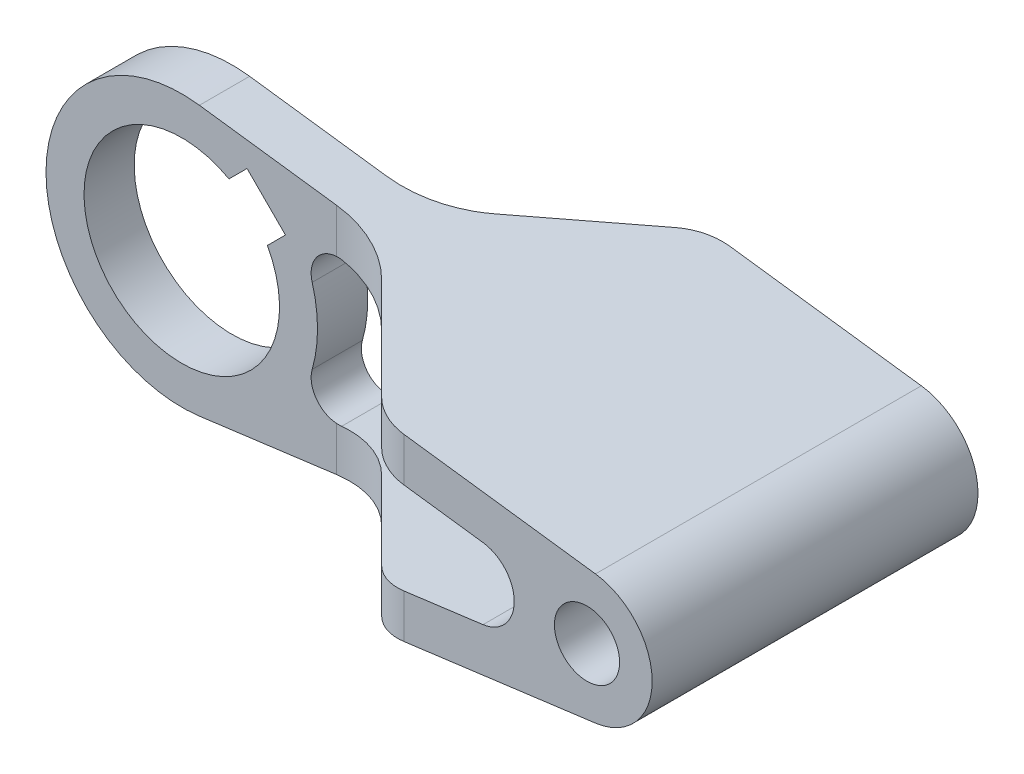
ISO-10303-21;
HEADER;
FILE_DESCRIPTION(('STEP AP214'),'2;1');
FILE_NAME('part.step','',(''),(''),'','','');
FILE_SCHEMA(('AUTOMOTIVE_DESIGN { 1 0 10303 214 1 1 1 1 }'));
ENDSEC;
DATA;
#1=APPLICATION_CONTEXT('core data for automotive mechanical design processes');
#2=APPLICATION_PROTOCOL_DEFINITION('international standard','automotive_design',2000,#1);
#3=PRODUCT_CONTEXT('',#1,'mechanical');
#4=PRODUCT('Part','Part','',(#3));
#5=PRODUCT_RELATED_PRODUCT_CATEGORY('part','',(#4));
#6=PRODUCT_DEFINITION_FORMATION('','',#4);
#7=PRODUCT_DEFINITION_CONTEXT('part definition',#1,'design');
#8=PRODUCT_DEFINITION('design','',#6,#7);
#9=PRODUCT_DEFINITION_SHAPE('','',#8);
#10=(LENGTH_UNIT() NAMED_UNIT(*) SI_UNIT(.MILLI.,.METRE.));
#11=(NAMED_UNIT(*) PLANE_ANGLE_UNIT() SI_UNIT($,.RADIAN.));
#12=(NAMED_UNIT(*) SI_UNIT($,.STERADIAN.) SOLID_ANGLE_UNIT());
#13=UNCERTAINTY_MEASURE_WITH_UNIT(LENGTH_MEASURE(1.E-05),#10,'distance_accuracy_value','');
#14=(GEOMETRIC_REPRESENTATION_CONTEXT(3) GLOBAL_UNCERTAINTY_ASSIGNED_CONTEXT((#13)) GLOBAL_UNIT_ASSIGNED_CONTEXT((#10,
#11,#12)) REPRESENTATION_CONTEXT('',''));
#15=CARTESIAN_POINT('',(0.,0.,0.));
#16=DIRECTION('',(0.,0.,1.));
#17=DIRECTION('',(1.,0.,0.));
#18=AXIS2_PLACEMENT_3D('',#15,#16,#17);
#19=CARTESIAN_POINT('',(-28.68481683323,8.32375888413215,30.));
#20=DIRECTION('',(0.,0.,-1.));
#21=DIRECTION('',(-1.,0.,0.));
#22=AXIS2_PLACEMENT_3D('',#19,#20,#21);
#23=CYLINDRICAL_SURFACE('',#22,5.00000000000005);
#24=CARTESIAN_POINT('',(-28.9834349837125,13.3148336381509,4.62148917251252));
#25=CARTESIAN_POINT('',(-28.8247121095358,13.324287625708,4.62150230724699));
#26=CARTESIAN_POINT('',(-28.6662991599073,13.3262225540891,4.62338467269021));
#27=CARTESIAN_POINT('',(-28.3500931097465,13.3150542924993,4.63088786499418));
#28=CARTESIAN_POINT('',(-28.1923000092142,13.3019511025283,4.63650869185494));
#29=CARTESIAN_POINT('',(-28.0348168332301,13.2813288533813,4.64399874942446));
#30=B_SPLINE_CURVE_WITH_KNOTS('',3,(#24,#25,#26,#27,#28,#29),.UNSPECIFIED.,.F.,.F.,(4,2,4),(0.,
0.475307846261125,0.9506156925236),.UNSPECIFIED.);
#31=CARTESIAN_POINT('',(-28.9834349837125,13.3148336381509,4.62148917251252));
#32=VERTEX_POINT('',#31);
#33=CARTESIAN_POINT('',(-28.0348168332301,13.2813288533813,4.64399874942446));
#34=VERTEX_POINT('',#33);
#35=EDGE_CURVE('E312',#32,#34,#30,.T.);
#36=ORIENTED_EDGE('',*,*,#35,.F.);
#37=CARTESIAN_POINT('',(-28.68481683323,8.32375888413215,4.62148917251252));
#38=DIRECTION('',(0.,0.,1.));
#39=DIRECTION('',(1.,0.,0.));
#40=AXIS2_PLACEMENT_3D('',#37,#38,#39);
#41=CIRCLE('',#40,5.00000000000005);
#42=CARTESIAN_POINT('',(-33.4885047626547,6.93646573677681,4.62148917251252));
#43=VERTEX_POINT('',#42);
#44=EDGE_CURVE('E244',#43,#32,#41,.F.);
#45=ORIENTED_EDGE('',*,*,#44,.F.);
#46=DIRECTION('',(0.,0.,-1.));
#47=VECTOR('',#46,1.);
#48=CARTESIAN_POINT('',(-33.4885047626547,6.93646573677681,30.));
#49=LINE('',#48,#47);
#50=CARTESIAN_POINT('',(-33.4885047626547,6.93646573677681,-4.62148917251252));
#51=VERTEX_POINT('',#50);
#52=EDGE_CURVE('E441',#43,#51,#49,.T.);
#53=ORIENTED_EDGE('',*,*,#52,.T.);
#54=CARTESIAN_POINT('',(-28.68481683323,8.32375888413215,-4.62148917251252));
#55=DIRECTION('',(0.,0.,1.));
#56=DIRECTION('',(1.,0.,0.));
#57=AXIS2_PLACEMENT_3D('',#54,#55,#56);
#58=CIRCLE('',#57,5.00000000000005);
#59=CARTESIAN_POINT('',(-28.9834349837125,13.3148336381509,-4.62148917251252));
#60=VERTEX_POINT('',#59);
#61=EDGE_CURVE('E525',#51,#60,#58,.F.);
#62=ORIENTED_EDGE('',*,*,#61,.T.);
#63=CARTESIAN_POINT('',(-28.0348168332301,13.2813288533813,-4.64399874942446));
#64=CARTESIAN_POINT('',(-28.1923000092142,13.3019511025283,-4.63650869185494));
#65=CARTESIAN_POINT('',(-28.3500931097465,13.3150542924993,-4.63088786499418));
#66=CARTESIAN_POINT('',(-28.6662991599073,13.3262225540891,-4.62338467269022));
#67=CARTESIAN_POINT('',(-28.8247121095358,13.324287625708,-4.62150230724699));
#68=CARTESIAN_POINT('',(-28.9834349837125,13.3148336381509,-4.62148917251253));
#69=B_SPLINE_CURVE_WITH_KNOTS('',3,(#63,#64,#65,#66,#67,#68),.UNSPECIFIED.,.F.,.F.,(4,2,4),(0.,
0.475307846262482,0.950615692523614),.UNSPECIFIED.);
#70=CARTESIAN_POINT('',(-28.0348168332301,13.2813288533813,-4.64399874942445));
#71=VERTEX_POINT('',#70);
#72=EDGE_CURVE('E333',#71,#60,#69,.T.);
#73=ORIENTED_EDGE('',*,*,#72,.F.);
#74=DIRECTION('',(0.,0.,-1.));
#75=VECTOR('',#74,1.);
#76=CARTESIAN_POINT('',(-28.0348168332301,13.2813288533813,30.));
#77=LINE('',#76,#75);
#78=EDGE_CURVE('E439',#34,#71,#77,.T.);
#79=ORIENTED_EDGE('',*,*,#78,.F.);
#80=EDGE_LOOP('',(#36,#45,#53,#62,#73,#79));
#81=FACE_BOUND('',#80,.T.);
#82=ADVANCED_FACE('F35',(#81),#23,.F.);
#83=CARTESIAN_POINT('',(1.23813263947478,9.44327567908777,30.));
#84=DIRECTION('',(0.130000000000003,0.991513993849809,0.));
#85=DIRECTION('',(-0.991513993849809,0.130000000000003,0.));
#86=AXIS2_PLACEMENT_3D('',#83,#84,#85);
#87=PLANE('',#86);
#88=DIRECTION('',(0.704087348631939,-0.092314738763051,-0.70408734863194));
#89=VECTOR('',#88,1.);
#90=CARTESIAN_POINT('',(-26.8002628385508,13.119463241495,1.4796099297878));
#91=LINE('',#90,#89);
#92=CARTESIAN_POINT('',(-14.8412993599814,11.5514921771859,-10.4793535487816));
#93=VERTEX_POINT('',#92);
#94=CARTESIAN_POINT('',(1.75041490310239,9.37610900803252,-27.0710678118655));
#95=VERTEX_POINT('',#94);
#96=EDGE_CURVE('E507',#93,#95,#91,.T.);
#97=ORIENTED_EDGE('',*,*,#96,.T.);
#98=CARTESIAN_POINT('',(8.82148271496788,8.4490027631944,-20.));
#99=DIRECTION('',(0.130000000000003,0.991513993849809,0.));
#100=DIRECTION('',(-0.991513993849809,0.130000000000003,0.));
#101=AXIS2_PLACEMENT_3D('',#98,#99,#100);
#102=ELLIPSE('',#101,10.0855863477755,10.);
#103=CARTESIAN_POINT('',(8.82148271496788,8.4490027631944,-30.));
#104=VERTEX_POINT('',#103);
#105=EDGE_CURVE('E393',#95,#104,#102,.F.);
#106=ORIENTED_EDGE('',*,*,#105,.T.);
#107=DIRECTION('',(0.991513993849809,-0.130000000000003,0.));
#108=VECTOR('',#107,1.);
#109=CARTESIAN_POINT('',(1.23813263947478,9.44327567908777,-30.));
#110=LINE('',#109,#108);
#111=CARTESIAN_POINT('',(23.3510555902217,6.54399235940866,-30.));
#112=VERTEX_POINT('',#111);
#113=EDGE_CURVE('E574',#104,#112,#110,.T.);
#114=ORIENTED_EDGE('',*,*,#113,.T.);
#115=DIRECTION('',(0.,0.,-1.));
#116=VECTOR('',#115,1.);
#117=CARTESIAN_POINT('',(23.3510555902217,6.54399235940866,30.));
#118=LINE('',#117,#116);
#119=CARTESIAN_POINT('',(23.3510555902217,6.54399235940866,30.));
#120=VERTEX_POINT('',#119);
#121=EDGE_CURVE('E436',#120,#112,#118,.T.);
#122=ORIENTED_EDGE('',*,*,#121,.F.);
#123=DIRECTION('',(0.991513993849809,-0.130000000000003,0.));
#124=VECTOR('',#123,1.);
#125=CARTESIAN_POINT('',(1.23813263947478,9.44327567908777,30.));
#126=LINE('',#125,#124);
#127=CARTESIAN_POINT('',(8.82148271496788,8.4490027631944,30.));
#128=VERTEX_POINT('',#127);
#129=EDGE_CURVE('E465',#128,#120,#126,.T.);
#130=ORIENTED_EDGE('',*,*,#129,.F.);
#131=CARTESIAN_POINT('',(8.82148271496788,8.4490027631944,20.));
#132=DIRECTION('',(0.130000000000003,0.991513993849809,0.));
#133=DIRECTION('',(0.991513993849809,-0.130000000000003,0.));
#134=AXIS2_PLACEMENT_3D('',#131,#132,#133);
#135=ELLIPSE('',#134,10.0855863477755,10.);
#136=CARTESIAN_POINT('',(1.7504149031024,9.37610900803251,27.0710678118655));
#137=VERTEX_POINT('',#136);
#138=EDGE_CURVE('E50',#128,#137,#135,.F.);
#139=ORIENTED_EDGE('',*,*,#138,.T.);
#140=DIRECTION('',(0.704087348631939,-0.092314738763051,0.70408734863194));
#141=VECTOR('',#140,1.);
#142=CARTESIAN_POINT('',(2.94407683166245,9.21960486217543,28.2647297404255));
#143=LINE('',#142,#141);
#144=CARTESIAN_POINT('',(-14.8412993599814,11.5514921771859,10.4793535487816));
#145=VERTEX_POINT('',#144);
#146=EDGE_CURVE('E261',#145,#137,#143,.T.);
#147=ORIENTED_EDGE('',*,*,#146,.F.);
#148=CARTESIAN_POINT('',(-28.9834349837124,13.4057046668622,24.6214891725125));
#149=DIRECTION('',(0.130000000000003,0.991513993849809,0.));
#150=DIRECTION('',(-0.991513993849809,0.130000000000003,0.));
#151=AXIS2_PLACEMENT_3D('',#148,#149,#150);
#152=ELLIPSE('',#151,20.171172695551,20.);
#153=EDGE_CURVE('E319',#34,#145,#152,.F.);
#154=ORIENTED_EDGE('',*,*,#153,.F.);
#155=ORIENTED_EDGE('',*,*,#78,.T.);
#156=CARTESIAN_POINT('',(-28.9834349837124,13.4057046668622,-24.6214891725125));
#157=DIRECTION('',(0.130000000000003,0.991513993849809,0.));
#158=DIRECTION('',(-0.991513993849809,0.130000000000003,0.));
#159=AXIS2_PLACEMENT_3D('',#156,#157,#158);
#160=ELLIPSE('',#159,20.171172695551,20.);
#161=EDGE_CURVE('E341',#93,#71,#160,.F.);
#162=ORIENTED_EDGE('',*,*,#161,.F.);
#163=EDGE_LOOP('',(#97,#106,#114,#122,#130,#139,#147,#154,#155,#162));
#164=FACE_BOUND('',#163,.T.);
#165=ADVANCED_FACE('F326',(#164),#87,.F.);
#166=CARTESIAN_POINT('',(1.23813263947475,-9.44327567908766,30.));
#167=DIRECTION('',(-0.130000000000003,0.991513993849809,0.));
#168=DIRECTION('',(-0.991513993849809,-0.130000000000003,0.));
#169=AXIS2_PLACEMENT_3D('',#166,#167,#168);
#170=PLANE('',#169);
#171=DIRECTION('',(0.991513993849809,0.130000000000003,0.));
#172=VECTOR('',#171,1.);
#173=CARTESIAN_POINT('',(1.23813263947475,-9.44327567908766,-30.));
#174=LINE('',#173,#172);
#175=CARTESIAN_POINT('',(8.82148271496788,-8.44900276319429,-30.));
#176=VERTEX_POINT('',#175);
#177=CARTESIAN_POINT('',(23.3510555902217,-6.54399235940856,-30.));
#178=VERTEX_POINT('',#177);
#179=EDGE_CURVE('E420',#176,#178,#174,.T.);
#180=ORIENTED_EDGE('',*,*,#179,.F.);
#181=CARTESIAN_POINT('',(8.82148271496788,-8.44900276319429,-20.));
#182=DIRECTION('',(-0.130000000000003,0.991513993849809,0.));
#183=DIRECTION('',(0.991513993849809,0.130000000000003,0.));
#184=AXIS2_PLACEMENT_3D('',#181,#182,#183);
#185=ELLIPSE('',#184,10.0855863477755,10.);
#186=CARTESIAN_POINT('',(1.75041490310241,-9.3761090080324,-27.0710678118655));
#187=VERTEX_POINT('',#186);
#188=EDGE_CURVE('E379',#176,#187,#185,.T.);
#189=ORIENTED_EDGE('',*,*,#188,.T.);
#190=DIRECTION('',(0.70408734863194,0.0923147387630504,-0.70408734863194));
#191=VECTOR('',#190,1.);
#192=CARTESIAN_POINT('',(-26.8002628385509,-13.1194632414949,1.47960992978781));
#193=LINE('',#192,#191);
#194=CARTESIAN_POINT('',(-14.8412993599814,-11.5514921771858,-10.4793535487816));
#195=VERTEX_POINT('',#194);
#196=EDGE_CURVE('E562',#195,#187,#193,.T.);
#197=ORIENTED_EDGE('',*,*,#196,.F.);
#198=CARTESIAN_POINT('',(-28.9834349837124,-13.405704666862,-24.6214891725125));
#199=DIRECTION('',(-0.130000000000003,0.991513993849809,0.));
#200=DIRECTION('',(0.991513993849809,0.130000000000003,0.));
#201=AXIS2_PLACEMENT_3D('',#198,#199,#200);
#202=ELLIPSE('',#201,20.171172695551,20.);
#203=CARTESIAN_POINT('',(-28.0348168332299,-13.2813288533812,-4.64399874942447));
#204=VERTEX_POINT('',#203);
#205=EDGE_CURVE('E528',#195,#204,#202,.F.);
#206=ORIENTED_EDGE('',*,*,#205,.T.);
#207=DIRECTION('',(0.,0.,-1.));
#208=VECTOR('',#207,1.);
#209=CARTESIAN_POINT('',(-28.0348168332299,-13.2813288533812,30.));
#210=LINE('',#209,#208);
#211=CARTESIAN_POINT('',(-28.0348168332299,-13.2813288533812,4.64399874942447));
#212=VERTEX_POINT('',#211);
#213=EDGE_CURVE('E430',#212,#204,#210,.T.);
#214=ORIENTED_EDGE('',*,*,#213,.F.);
#215=CARTESIAN_POINT('',(-28.9834349837124,-13.405704666862,24.6214891725125));
#216=DIRECTION('',(-0.130000000000003,0.991513993849809,0.));
#217=DIRECTION('',(0.991513993849809,0.130000000000003,0.));
#218=AXIS2_PLACEMENT_3D('',#215,#216,#217);
#219=ELLIPSE('',#218,20.171172695551,20.);
#220=CARTESIAN_POINT('',(-14.8412993599814,-11.5514921771858,10.4793535487816));
#221=VERTEX_POINT('',#220);
#222=EDGE_CURVE('E293',#212,#221,#219,.F.);
#223=ORIENTED_EDGE('',*,*,#222,.T.);
#224=DIRECTION('',(0.70408734863194,0.0923147387630504,0.70408734863194));
#225=VECTOR('',#224,1.);
#226=CARTESIAN_POINT('',(2.94407683166244,-9.21960486217532,28.2647297404255));
#227=LINE('',#226,#225);
#228=CARTESIAN_POINT('',(1.7504149031024,-9.3761090080324,27.0710678118655));
#229=VERTEX_POINT('',#228);
#230=EDGE_CURVE('E252',#221,#229,#227,.T.);
#231=ORIENTED_EDGE('',*,*,#230,.T.);
#232=CARTESIAN_POINT('',(8.82148271496788,-8.44900276319429,20.));
#233=DIRECTION('',(-0.130000000000003,0.991513993849809,0.));
#234=DIRECTION('',(-0.991513993849809,-0.130000000000003,0.));
#235=AXIS2_PLACEMENT_3D('',#232,#233,#234);
#236=ELLIPSE('',#235,10.0855863477755,10.);
#237=CARTESIAN_POINT('',(8.82148271496788,-8.44900276319429,30.));
#238=VERTEX_POINT('',#237);
#239=EDGE_CURVE('E377',#229,#238,#236,.T.);
#240=ORIENTED_EDGE('',*,*,#239,.T.);
#241=DIRECTION('',(0.991513993849809,0.130000000000003,0.));
#242=VECTOR('',#241,1.);
#243=CARTESIAN_POINT('',(1.23813263947475,-9.44327567908766,30.));
#244=LINE('',#243,#242);
#245=CARTESIAN_POINT('',(23.3510555902217,-6.54399235940856,30.));
#246=VERTEX_POINT('',#245);
#247=EDGE_CURVE('E412',#238,#246,#244,.T.);
#248=ORIENTED_EDGE('',*,*,#247,.T.);
#249=DIRECTION('',(0.,0.,-1.));
#250=VECTOR('',#249,1.);
#251=CARTESIAN_POINT('',(23.3510555902217,-6.54399235940856,30.));
#252=LINE('',#251,#250);
#253=EDGE_CURVE('E433',#246,#178,#252,.T.);
#254=ORIENTED_EDGE('',*,*,#253,.T.);
#255=EDGE_LOOP('',(#180,#189,#197,#206,#214,#223,#231,#240,#248,#254));
#256=FACE_BOUND('',#255,.T.);
#257=ADVANCED_FACE('F403',(#256),#170,.T.);
#258=CARTESIAN_POINT('',(-28.6848168332299,-8.3237588841321,30.));
#259=DIRECTION('',(0.,0.,-1.));
#260=DIRECTION('',(-1.,0.,0.));
#261=AXIS2_PLACEMENT_3D('',#258,#259,#260);
#262=CYLINDRICAL_SURFACE('',#261,5.00000000000001);
#263=CARTESIAN_POINT('',(-28.0348168332299,-13.2813288533812,4.64399874942447));
#264=CARTESIAN_POINT('',(-28.192300009214,-13.3019511025282,4.63650869185494));
#265=CARTESIAN_POINT('',(-28.3500931097464,-13.3150542924992,4.63088786499419));
#266=CARTESIAN_POINT('',(-28.6662991599073,-13.326222554089,4.62338467269022));
#267=CARTESIAN_POINT('',(-28.8247121095358,-13.3242876257079,4.62150230724699));
#268=CARTESIAN_POINT('',(-28.9834349837125,-13.3148336381508,4.62148917251253));
#269=B_SPLINE_CURVE_WITH_KNOTS('',3,(#263,#264,#265,#266,#267,#268),.UNSPECIFIED.,.F.,.F.,(4,2,
4),(0.,0.475307846262559,0.950615692523768),.UNSPECIFIED.);
#270=CARTESIAN_POINT('',(-28.9834349837125,-13.3148336381508,4.62148917251252));
#271=VERTEX_POINT('',#270);
#272=EDGE_CURVE('E243',#212,#271,#269,.T.);
#273=ORIENTED_EDGE('',*,*,#272,.F.);
#274=ORIENTED_EDGE('',*,*,#213,.T.);
#275=CARTESIAN_POINT('',(-28.9834349837125,-13.3148336381508,-4.62148917251252));
#276=CARTESIAN_POINT('',(-28.8247121095358,-13.3242876257079,-4.62150230724699));
#277=CARTESIAN_POINT('',(-28.6662991599073,-13.326222554089,-4.62338467269022));
#278=CARTESIAN_POINT('',(-28.3500931097464,-13.3150542924992,-4.63088786499419));
#279=CARTESIAN_POINT('',(-28.192300009214,-13.3019511025282,-4.63650869185494));
#280=CARTESIAN_POINT('',(-28.0348168332299,-13.2813288533812,-4.64399874942447));
#281=B_SPLINE_CURVE_WITH_KNOTS('',3,(#275,#276,#277,#278,#279,#280),.UNSPECIFIED.,.F.,.F.,(4,2,
4),(0.,0.475307846261216,0.950615692523782),.UNSPECIFIED.);
#282=CARTESIAN_POINT('',(-28.9834349837125,-13.3148336381508,-4.62148917251252));
#283=VERTEX_POINT('',#282);
#284=EDGE_CURVE('E357',#283,#204,#281,.T.);
#285=ORIENTED_EDGE('',*,*,#284,.F.);
#286=CARTESIAN_POINT('',(-28.6848168332299,-8.3237588841321,-4.62148917251252));
#287=DIRECTION('',(0.,0.,1.));
#288=DIRECTION('',(1.,0.,0.));
#289=AXIS2_PLACEMENT_3D('',#286,#287,#288);
#290=CIRCLE('',#289,5.00000000000001);
#291=CARTESIAN_POINT('',(-33.4885047626546,-6.93646573677674,-4.62148917251252));
#292=VERTEX_POINT('',#291);
#293=EDGE_CURVE('E519',#283,#292,#290,.F.);
#294=ORIENTED_EDGE('',*,*,#293,.T.);
#295=DIRECTION('',(0.,0.,-1.));
#296=VECTOR('',#295,1.);
#297=CARTESIAN_POINT('',(-33.4885047626547,-6.93646573677673,30.));
#298=LINE('',#297,#296);
#299=CARTESIAN_POINT('',(-33.4885047626547,-6.93646573677673,4.62148917251252));
#300=VERTEX_POINT('',#299);
#301=EDGE_CURVE('E428',#300,#292,#298,.T.);
#302=ORIENTED_EDGE('',*,*,#301,.F.);
#303=CARTESIAN_POINT('',(-28.6848168332299,-8.3237588841321,4.62148917251252));
#304=DIRECTION('',(0.,0.,1.));
#305=DIRECTION('',(1.,0.,0.));
#306=AXIS2_PLACEMENT_3D('',#303,#304,#305);
#307=CIRCLE('',#306,5.00000000000001);
#308=EDGE_CURVE('E284',#271,#300,#307,.F.);
#309=ORIENTED_EDGE('',*,*,#308,.F.);
#310=EDGE_LOOP('',(#273,#274,#285,#294,#302,#309));
#311=FACE_BOUND('',#310,.T.);
#312=ADVANCED_FACE('F295',(#311),#262,.F.);
#313=CARTESIAN_POINT('',(-57.5069444097783,0.,30.));
#314=DIRECTION('',(0.,0.,-1.));
#315=DIRECTION('',(-1.,0.,0.));
#316=AXIS2_PLACEMENT_3D('',#313,#314,#315);
#317=CYLINDRICAL_SURFACE('',#316,25.);
#318=CARTESIAN_POINT('',(-57.5069444097783,0.,4.62148917251252));
#319=DIRECTION('',(0.,0.,1.));
#320=DIRECTION('',(1.,0.,0.));
#321=AXIS2_PLACEMENT_3D('',#318,#319,#320);
#322=CIRCLE('',#321,25.);
#323=EDGE_CURVE('E282',#300,#43,#322,.T.);
#324=ORIENTED_EDGE('',*,*,#323,.F.);
#325=ORIENTED_EDGE('',*,*,#301,.T.);
#326=CARTESIAN_POINT('',(-57.5069444097783,0.,-4.62148917251252));
#327=DIRECTION('',(0.,0.,1.));
#328=DIRECTION('',(1.,0.,0.));
#329=AXIS2_PLACEMENT_3D('',#326,#327,#328);
#330=CIRCLE('',#329,25.);
#331=EDGE_CURVE('E522',#292,#51,#330,.T.);
#332=ORIENTED_EDGE('',*,*,#331,.T.);
#333=ORIENTED_EDGE('',*,*,#52,.F.);
#334=EDGE_LOOP('',(#324,#325,#332,#333));
#335=FACE_BOUND('',#334,.T.);
#336=ADVANCED_FACE('F329',(#335),#317,.T.);
#337=CARTESIAN_POINT('',(-57.5069444097783,0.,30.));
#338=DIRECTION('',(0.,0.,-1.));
#339=DIRECTION('',(-1.,0.,0.));
#340=AXIS2_PLACEMENT_3D('',#337,#338,#339);
#341=CYLINDRICAL_SURFACE('',#340,18.);
#342=DIRECTION('',(0.,0.,-1.));
#343=VECTOR('',#342,1.);
#344=CARTESIAN_POINT('',(-48.8154590550736,15.7625531665703,30.));
#345=LINE('',#344,#343);
#346=CARTESIAN_POINT('',(-48.8154590550736,15.7625531665703,4.62148917251252));
#347=VERTEX_POINT('',#346);
#348=CARTESIAN_POINT('',(-48.8154590550736,15.7625531665703,-4.62148917251252));
#349=VERTEX_POINT('',#348);
#350=EDGE_CURVE('E431',#347,#349,#345,.T.);
#351=ORIENTED_EDGE('',*,*,#350,.F.);
#352=CARTESIAN_POINT('',(-57.5069444097783,0.,4.62148917251252));
#353=DIRECTION('',(0.,0.,1.));
#354=DIRECTION('',(1.,0.,0.));
#355=AXIS2_PLACEMENT_3D('',#352,#353,#354);
#356=CIRCLE('',#355,18.);
#357=CARTESIAN_POINT('',(-41.7443912432081,8.69148535470485,4.62148917251252));
#358=VERTEX_POINT('',#357);
#359=EDGE_CURVE('E279',#347,#358,#356,.T.);
#360=ORIENTED_EDGE('',*,*,#359,.T.);
#361=DIRECTION('',(0.,0.,-1.));
#362=VECTOR('',#361,1.);
#363=CARTESIAN_POINT('',(-41.7443912432081,8.69148535470485,30.));
#364=LINE('',#363,#362);
#365=CARTESIAN_POINT('',(-41.7443912432081,8.69148535470485,-4.62148917251252));
#366=VERTEX_POINT('',#365);
#367=EDGE_CURVE('E443',#358,#366,#364,.T.);
#368=ORIENTED_EDGE('',*,*,#367,.T.);
#369=CARTESIAN_POINT('',(-57.5069444097783,0.,-4.62148917251252));
#370=DIRECTION('',(0.,0.,1.));
#371=DIRECTION('',(1.,0.,0.));
#372=AXIS2_PLACEMENT_3D('',#369,#370,#371);
#373=CIRCLE('',#372,18.);
#374=EDGE_CURVE('E516',#349,#366,#373,.T.);
#375=ORIENTED_EDGE('',*,*,#374,.F.);
#376=EDGE_LOOP('',(#351,#360,#368,#375));
#377=FACE_BOUND('',#376,.T.);
#378=ADVANCED_FACE('F626',(#377),#341,.F.);
#379=CARTESIAN_POINT('',(-32.289006110822,32.289006110822,30.));
#380=DIRECTION('',(-0.707106781186548,0.707106781186547,0.));
#381=DIRECTION('',(-0.707106781186547,-0.707106781186548,0.));
#382=AXIS2_PLACEMENT_3D('',#379,#380,#381);
#383=PLANE('',#382);
#384=DIRECTION('',(0.707106781186547,0.707106781186548,0.));
#385=VECTOR('',#384,1.);
#386=CARTESIAN_POINT('',(-32.289006110822,32.289006110822,4.62148917251252));
#387=LINE('',#386,#385);
#388=CARTESIAN_POINT('',(-45.486129129607,19.0918830920369,4.62148917251252));
#389=VERTEX_POINT('',#388);
#390=EDGE_CURVE('E277',#347,#389,#387,.T.);
#391=ORIENTED_EDGE('',*,*,#390,.F.);
#392=ORIENTED_EDGE('',*,*,#350,.T.);
#393=DIRECTION('',(0.707106781186547,0.707106781186548,0.));
#394=VECTOR('',#393,1.);
#395=CARTESIAN_POINT('',(-32.289006110822,32.289006110822,-4.62148917251252));
#396=LINE('',#395,#394);
#397=CARTESIAN_POINT('',(-45.486129129607,19.0918830920369,-4.62148917251252));
#398=VERTEX_POINT('',#397);
#399=EDGE_CURVE('E513',#349,#398,#396,.T.);
#400=ORIENTED_EDGE('',*,*,#399,.T.);
#401=DIRECTION('',(0.,0.,-1.));
#402=VECTOR('',#401,1.);
#403=CARTESIAN_POINT('',(-45.486129129607,19.0918830920369,30.));
#404=LINE('',#403,#402);
#405=EDGE_CURVE('E447',#389,#398,#404,.T.);
#406=ORIENTED_EDGE('',*,*,#405,.F.);
#407=EDGE_LOOP('',(#391,#392,#400,#406));
#408=FACE_BOUND('',#407,.T.);
#409=ADVANCED_FACE('F625',(#408),#383,.F.);
#410=CARTESIAN_POINT('',(-13.1971230187851,-13.1971230187851,30.));
#411=DIRECTION('',(0.707106781186547,0.707106781186548,0.));
#412=DIRECTION('',(-0.707106781186548,0.707106781186547,0.));
#413=AXIS2_PLACEMENT_3D('',#410,#411,#412);
#414=PLANE('',#413);
#415=DIRECTION('',(0.707106781186548,-0.707106781186547,0.));
#416=VECTOR('',#415,1.);
#417=CARTESIAN_POINT('',(-13.1971230187851,-13.1971230187851,4.62148917251252));
#418=LINE('',#417,#416);
#419=CARTESIAN_POINT('',(-38.4150613177415,12.0208152801714,4.62148917251252));
#420=VERTEX_POINT('',#419);
#421=EDGE_CURVE('E275',#389,#420,#418,.T.);
#422=ORIENTED_EDGE('',*,*,#421,.F.);
#423=ORIENTED_EDGE('',*,*,#405,.T.);
#424=DIRECTION('',(0.707106781186548,-0.707106781186547,0.));
#425=VECTOR('',#424,1.);
#426=CARTESIAN_POINT('',(-13.1971230187851,-13.1971230187851,-4.62148917251252));
#427=LINE('',#426,#425);
#428=CARTESIAN_POINT('',(-38.4150613177415,12.0208152801714,-4.62148917251252));
#429=VERTEX_POINT('',#428);
#430=EDGE_CURVE('E505',#398,#429,#427,.T.);
#431=ORIENTED_EDGE('',*,*,#430,.T.);
#432=DIRECTION('',(0.,0.,-1.));
#433=VECTOR('',#432,1.);
#434=CARTESIAN_POINT('',(-38.4150613177415,12.0208152801714,30.));
#435=LINE('',#434,#433);
#436=EDGE_CURVE('E445',#420,#429,#435,.T.);
#437=ORIENTED_EDGE('',*,*,#436,.F.);
#438=EDGE_LOOP('',(#422,#423,#431,#437));
#439=FACE_BOUND('',#438,.T.);
#440=ADVANCED_FACE('F621',(#439),#414,.F.);
#441=CARTESIAN_POINT('',(2.2781326394747,-17.3753876298862,30.));
#442=DIRECTION('',(-0.129999999999998,0.99151399384981,0.));
#443=DIRECTION('',(-0.99151399384981,-0.129999999999998,0.));
#444=AXIS2_PLACEMENT_3D('',#441,#442,#443);
#445=PLANE('',#444);
#446=DIRECTION('',(0.70408734863194,0.0923147387630472,-0.70408734863194));
#447=VECTOR('',#446,1.);
#448=CARTESIAN_POINT('',(-26.2758313928346,-21.1191727375348,0.955178484071558));
#449=LINE('',#448,#447);
#450=CARTESIAN_POINT('',(-14.8412993599814,-19.6199612554061,-10.4793535487816));
#451=VERTEX_POINT('',#450);
#452=CARTESIAN_POINT('',(1.7504149031024,-17.4445780862528,-27.0710678118655));
#453=VERTEX_POINT('',#452);
#454=EDGE_CURVE('E553',#451,#453,#449,.T.);
#455=ORIENTED_EDGE('',*,*,#454,.T.);
#456=CARTESIAN_POINT('',(8.82148271496788,-16.5174718414147,-20.));
#457=DIRECTION('',(-0.129999999999998,0.99151399384981,0.));
#458=DIRECTION('',(0.99151399384981,0.129999999999998,0.));
#459=AXIS2_PLACEMENT_3D('',#456,#457,#458);
#460=ELLIPSE('',#459,10.0855863477755,10.);
#461=CARTESIAN_POINT('',(8.82148271496788,-16.5174718414147,-30.));
#462=VERTEX_POINT('',#461);
#463=EDGE_CURVE('E384',#453,#462,#460,.F.);
#464=ORIENTED_EDGE('',*,*,#463,.T.);
#465=DIRECTION('',(0.99151399384981,0.129999999999998,0.));
#466=VECTOR('',#465,1.);
#467=CARTESIAN_POINT('',(2.2781326394747,-17.3753876298862,-30.));
#468=LINE('',#467,#466);
#469=CARTESIAN_POINT('',(44.0530555902217,-11.8981679261976,-30.));
#470=VERTEX_POINT('',#469);
#471=EDGE_CURVE('E340',#462,#470,#468,.T.);
#472=ORIENTED_EDGE('',*,*,#471,.T.);
#473=DIRECTION('',(0.,0.,-1.));
#474=VECTOR('',#473,1.);
#475=CARTESIAN_POINT('',(44.0530555902217,-11.8981679261976,30.));
#476=LINE('',#475,#474);
#477=CARTESIAN_POINT('',(44.0530555902217,-11.8981679261976,30.));
#478=VERTEX_POINT('',#477);
#479=EDGE_CURVE('E415',#478,#470,#476,.T.);
#480=ORIENTED_EDGE('',*,*,#479,.F.);
#481=DIRECTION('',(0.99151399384981,0.129999999999998,0.));
#482=VECTOR('',#481,1.);
#483=CARTESIAN_POINT('',(2.2781326394747,-17.3753876298862,30.));
#484=LINE('',#483,#482);
#485=CARTESIAN_POINT('',(8.82148271496788,-16.5174718414147,30.));
#486=VERTEX_POINT('',#485);
#487=EDGE_CURVE('E343',#486,#478,#484,.T.);
#488=ORIENTED_EDGE('',*,*,#487,.F.);
#489=CARTESIAN_POINT('',(8.82148271496788,-16.5174718414147,20.));
#490=DIRECTION('',(-0.129999999999998,0.99151399384981,0.));
#491=DIRECTION('',(-0.99151399384981,-0.129999999999998,0.));
#492=AXIS2_PLACEMENT_3D('',#489,#490,#491);
#493=ELLIPSE('',#492,10.0855863477755,10.);
#494=CARTESIAN_POINT('',(1.7504149031024,-17.4445780862528,27.0710678118655));
#495=VERTEX_POINT('',#494);
#496=EDGE_CURVE('E259',#486,#495,#493,.F.);
#497=ORIENTED_EDGE('',*,*,#496,.T.);
#498=DIRECTION('',(0.70408734863194,0.0923147387630472,0.70408734863194));
#499=VECTOR('',#498,1.);
#500=CARTESIAN_POINT('',(3.46850827737872,-17.2193143582154,28.7891611861418));
#501=LINE('',#500,#499);
#502=CARTESIAN_POINT('',(-14.8412993599814,-19.6199612554061,10.4793535487816));
#503=VERTEX_POINT('',#502);
#504=EDGE_CURVE('E249',#503,#495,#501,.T.);
#505=ORIENTED_EDGE('',*,*,#504,.F.);
#506=CARTESIAN_POINT('',(-28.9834349837124,-21.4741737450823,24.6214891725125));
#507=DIRECTION('',(-0.129999999999998,0.99151399384981,0.));
#508=DIRECTION('',(0.99151399384981,0.129999999999998,0.));
#509=AXIS2_PLACEMENT_3D('',#506,#507,#508);
#510=ELLIPSE('',#509,20.171172695551,20.);
#511=CARTESIAN_POINT('',(-28.9834349837125,-21.4741737450823,4.62148917251252));
#512=VERTEX_POINT('',#511);
#513=EDGE_CURVE('E233',#512,#503,#510,.F.);
#514=ORIENTED_EDGE('',*,*,#513,.F.);
#515=DIRECTION('',(0.99151399384981,0.129999999999998,0.));
#516=VECTOR('',#515,1.);
#517=CARTESIAN_POINT('',(2.2781326394747,-17.3753876298862,4.62148917251252));
#518=LINE('',#517,#516);
#519=CARTESIAN_POINT('',(-54.2569444097784,-24.787849846245,4.62148917251252));
#520=VERTEX_POINT('',#519);
#521=EDGE_CURVE('E271',#520,#512,#518,.T.);
#522=ORIENTED_EDGE('',*,*,#521,.F.);
#523=DIRECTION('',(0.,0.,-1.));
#524=VECTOR('',#523,1.);
#525=CARTESIAN_POINT('',(-54.2569444097784,-24.787849846245,30.));
#526=LINE('',#525,#524);
#527=CARTESIAN_POINT('',(-54.2569444097784,-24.787849846245,-4.62148917251252));
#528=VERTEX_POINT('',#527);
#529=EDGE_CURVE('E450',#520,#528,#526,.T.);
#530=ORIENTED_EDGE('',*,*,#529,.T.);
#531=DIRECTION('',(0.99151399384981,0.129999999999998,0.));
#532=VECTOR('',#531,1.);
#533=CARTESIAN_POINT('',(2.2781326394747,-17.3753876298862,-4.62148917251252));
#534=LINE('',#533,#532);
#535=CARTESIAN_POINT('',(-28.9834349837125,-21.4741737450823,-4.62148917251252));
#536=VERTEX_POINT('',#535);
#537=EDGE_CURVE('E498',#528,#536,#534,.T.);
#538=ORIENTED_EDGE('',*,*,#537,.T.);
#539=CARTESIAN_POINT('',(-28.9834349837124,-21.4741737450823,-24.6214891725125));
#540=DIRECTION('',(-0.129999999999998,0.99151399384981,0.));
#541=DIRECTION('',(0.99151399384981,0.129999999999998,0.));
#542=AXIS2_PLACEMENT_3D('',#539,#540,#541);
#543=ELLIPSE('',#542,20.171172695551,20.);
#544=EDGE_CURVE('E532',#451,#536,#543,.F.);
#545=ORIENTED_EDGE('',*,*,#544,.F.);
#546=EDGE_LOOP('',(#455,#464,#472,#480,#488,#497,#505,#514,#522,#530,#538,#545));
#547=FACE_BOUND('',#546,.T.);
#548=ADVANCED_FACE('F257',(#547),#445,.F.);
#549=CARTESIAN_POINT('',(2.27813263947474,17.3753876298862,30.));
#550=DIRECTION('',(0.13,0.991513993849809,0.));
#551=DIRECTION('',(-0.991513993849809,0.13,0.));
#552=AXIS2_PLACEMENT_3D('',#549,#550,#551);
#553=PLANE('',#552);
#554=DIRECTION('',(0.991513993849809,-0.13,0.));
#555=VECTOR('',#554,1.);
#556=CARTESIAN_POINT('',(2.27813263947474,17.3753876298862,-30.));
#557=LINE('',#556,#555);
#558=CARTESIAN_POINT('',(8.82148271496788,16.5174718414148,-30.));
#559=VERTEX_POINT('',#558);
#560=CARTESIAN_POINT('',(44.0530555902217,11.8981679261977,-30.));
#561=VERTEX_POINT('',#560);
#562=EDGE_CURVE('E572',#559,#561,#557,.T.);
#563=ORIENTED_EDGE('',*,*,#562,.F.);
#564=CARTESIAN_POINT('',(8.82148271496788,16.5174718414148,-20.));
#565=DIRECTION('',(0.13,0.991513993849809,0.));
#566=DIRECTION('',(-0.991513993849809,0.13,0.));
#567=AXIS2_PLACEMENT_3D('',#564,#565,#566);
#568=ELLIPSE('',#567,10.0855863477755,10.);
#569=CARTESIAN_POINT('',(1.75041490310241,17.4445780862529,-27.0710678118655));
#570=VERTEX_POINT('',#569);
#571=EDGE_CURVE('E388',#559,#570,#568,.T.);
#572=ORIENTED_EDGE('',*,*,#571,.T.);
#573=DIRECTION('',(0.70408734863194,-0.0923147387630486,-0.70408734863194));
#574=VECTOR('',#573,1.);
#575=CARTESIAN_POINT('',(-26.2758313928346,21.1191727375349,0.955178484071534));
#576=LINE('',#575,#574);
#577=CARTESIAN_POINT('',(-14.8412993599814,19.6199612554063,-10.4793535487816));
#578=VERTEX_POINT('',#577);
#579=EDGE_CURVE('E551',#578,#570,#576,.T.);
#580=ORIENTED_EDGE('',*,*,#579,.F.);
#581=CARTESIAN_POINT('',(-28.9834349837124,21.4741737450824,-24.6214891725125));
#582=DIRECTION('',(0.13,0.991513993849809,0.));
#583=DIRECTION('',(-0.991513993849809,0.13,0.));
#584=AXIS2_PLACEMENT_3D('',#581,#582,#583);
#585=ELLIPSE('',#584,20.171172695551,20.);
#586=CARTESIAN_POINT('',(-28.9834349837125,21.4741737450825,-4.62148917251252));
#587=VERTEX_POINT('',#586);
#588=EDGE_CURVE('E531',#578,#587,#585,.F.);
#589=ORIENTED_EDGE('',*,*,#588,.T.);
#590=DIRECTION('',(0.991513993849809,-0.13,0.));
#591=VECTOR('',#590,1.);
#592=CARTESIAN_POINT('',(2.27813263947474,17.3753876298862,-4.62148917251252));
#593=LINE('',#592,#591);
#594=CARTESIAN_POINT('',(-54.2569444097783,24.7878498462452,-4.62148917251252));
#595=VERTEX_POINT('',#594);
#596=EDGE_CURVE('E485',#595,#587,#593,.T.);
#597=ORIENTED_EDGE('',*,*,#596,.F.);
#598=DIRECTION('',(0.,0.,-1.));
#599=VECTOR('',#598,1.);
#600=CARTESIAN_POINT('',(-54.2569444097783,24.7878498462452,30.));
#601=LINE('',#600,#599);
#602=CARTESIAN_POINT('',(-54.2569444097783,24.7878498462452,4.62148917251252));
#603=VERTEX_POINT('',#602);
#604=EDGE_CURVE('E452',#603,#595,#601,.T.);
#605=ORIENTED_EDGE('',*,*,#604,.F.);
#606=DIRECTION('',(0.991513993849809,-0.13,0.));
#607=VECTOR('',#606,1.);
#608=CARTESIAN_POINT('',(2.27813263947474,17.3753876298862,4.62148917251252));
#609=LINE('',#608,#607);
#610=CARTESIAN_POINT('',(-28.9834349837125,21.4741737450825,4.62148917251252));
#611=VERTEX_POINT('',#610);
#612=EDGE_CURVE('E268',#603,#611,#609,.T.);
#613=ORIENTED_EDGE('',*,*,#612,.T.);
#614=CARTESIAN_POINT('',(-28.9834349837124,21.4741737450824,24.6214891725125));
#615=DIRECTION('',(0.13,0.991513993849809,0.));
#616=DIRECTION('',(-0.991513993849809,0.13,0.));
#617=AXIS2_PLACEMENT_3D('',#614,#615,#616);
#618=ELLIPSE('',#617,20.171172695551,20.);
#619=CARTESIAN_POINT('',(-14.8412993599814,19.6199612554063,10.4793535487816));
#620=VERTEX_POINT('',#619);
#621=EDGE_CURVE('E368',#611,#620,#618,.F.);
#622=ORIENTED_EDGE('',*,*,#621,.T.);
#623=DIRECTION('',(0.70408734863194,-0.0923147387630486,0.70408734863194));
#624=VECTOR('',#623,1.);
#625=CARTESIAN_POINT('',(3.46850827737874,17.2193143582154,28.7891611861418));
#626=LINE('',#625,#624);
#627=CARTESIAN_POINT('',(1.75041490310241,17.4445780862529,27.0710678118655));
#628=VERTEX_POINT('',#627);
#629=EDGE_CURVE('E253',#620,#628,#626,.T.);
#630=ORIENTED_EDGE('',*,*,#629,.T.);
#631=CARTESIAN_POINT('',(8.82148271496788,16.5174718414148,20.));
#632=DIRECTION('',(0.13,0.991513993849809,0.));
#633=DIRECTION('',(0.991513993849809,-0.13,0.));
#634=AXIS2_PLACEMENT_3D('',#631,#632,#633);
#635=ELLIPSE('',#634,10.0855863477755,10.);
#636=CARTESIAN_POINT('',(8.82148271496788,16.5174718414148,30.));
#637=VERTEX_POINT('',#636);
#638=EDGE_CURVE('E386',#628,#637,#635,.T.);
#639=ORIENTED_EDGE('',*,*,#638,.T.);
#640=DIRECTION('',(0.991513993849809,-0.13,0.));
#641=VECTOR('',#640,1.);
#642=CARTESIAN_POINT('',(2.27813263947474,17.3753876298862,30.));
#643=LINE('',#642,#641);
#644=CARTESIAN_POINT('',(44.0530555902217,11.8981679261977,30.));
#645=VERTEX_POINT('',#644);
#646=EDGE_CURVE('E418',#637,#645,#643,.T.);
#647=ORIENTED_EDGE('',*,*,#646,.T.);
#648=DIRECTION('',(0.,0.,-1.));
#649=VECTOR('',#648,1.);
#650=CARTESIAN_POINT('',(44.0530555902217,11.8981679261977,30.));
#651=LINE('',#650,#649);
#652=EDGE_CURVE('E455',#645,#561,#651,.T.);
#653=ORIENTED_EDGE('',*,*,#652,.T.);
#654=EDGE_LOOP('',(#563,#572,#580,#589,#597,#605,#613,#622,#630,#639,#647,#653));
#655=FACE_BOUND('',#654,.T.);
#656=ADVANCED_FACE('F469',(#655),#553,.T.);
#657=CARTESIAN_POINT('',(-25.2179382989565,25.2179382989565,30.));
#658=DIRECTION('',(0.707106781186548,-0.707106781186547,0.));
#659=DIRECTION('',(0.707106781186547,0.707106781186548,0.));
#660=AXIS2_PLACEMENT_3D('',#657,#658,#659);
#661=PLANE('',#660);
#662=DIRECTION('',(-0.707106781186547,-0.707106781186548,0.));
#663=VECTOR('',#662,1.);
#664=CARTESIAN_POINT('',(-25.2179382989565,25.2179382989565,4.62148917251252));
#665=LINE('',#664,#663);
#666=EDGE_CURVE('E273',#420,#358,#665,.T.);
#667=ORIENTED_EDGE('',*,*,#666,.F.);
#668=ORIENTED_EDGE('',*,*,#436,.T.);
#669=DIRECTION('',(-0.707106781186547,-0.707106781186548,0.));
#670=VECTOR('',#669,1.);
#671=CARTESIAN_POINT('',(-25.2179382989565,25.2179382989565,-4.62148917251252));
#672=LINE('',#671,#670);
#673=EDGE_CURVE('E502',#429,#366,#672,.T.);
#674=ORIENTED_EDGE('',*,*,#673,.T.);
#675=ORIENTED_EDGE('',*,*,#367,.F.);
#676=EDGE_LOOP('',(#667,#668,#674,#675));
#677=FACE_BOUND('',#676,.T.);
#678=ADVANCED_FACE('F617',(#677),#661,.F.);
#679=CARTESIAN_POINT('',(-57.5069444097783,0.,30.));
#680=DIRECTION('',(0.,0.,-1.));
#681=DIRECTION('',(-1.,0.,0.));
#682=AXIS2_PLACEMENT_3D('',#679,#680,#681);
#683=CYLINDRICAL_SURFACE('',#682,24.9999999999999);
#684=ORIENTED_EDGE('',*,*,#529,.F.);
#685=CARTESIAN_POINT('',(-57.5069444097783,0.,4.62148917251252));
#686=DIRECTION('',(0.,0.,1.));
#687=DIRECTION('',(1.,0.,0.));
#688=AXIS2_PLACEMENT_3D('',#685,#686,#687);
#689=CIRCLE('',#688,24.9999999999999);
#690=EDGE_CURVE('E364',#603,#520,#689,.T.);
#691=ORIENTED_EDGE('',*,*,#690,.F.);
#692=ORIENTED_EDGE('',*,*,#604,.T.);
#693=CARTESIAN_POINT('',(-57.5069444097783,0.,-4.62148917251252));
#694=DIRECTION('',(0.,0.,1.));
#695=DIRECTION('',(1.,0.,0.));
#696=AXIS2_PLACEMENT_3D('',#693,#694,#695);
#697=CIRCLE('',#696,24.9999999999999);
#698=EDGE_CURVE('E365',#595,#528,#697,.T.);
#699=ORIENTED_EDGE('',*,*,#698,.T.);
#700=EDGE_LOOP('',(#684,#691,#692,#699));
#701=FACE_BOUND('',#700,.T.);
#702=ADVANCED_FACE('F490',(#701),#683,.T.);
#703=CARTESIAN_POINT('',(0.,0.,30.));
#704=DIRECTION('',(0.,0.,1.));
#705=DIRECTION('',(1.,0.,0.));
#706=AXIS2_PLACEMENT_3D('',#703,#704,#705);
#707=PLANE('',#706);
#708=CARTESIAN_POINT('',(42.4930555902217,0.,30.));
#709=DIRECTION('',(0.,0.,1.));
#710=DIRECTION('',(1.,0.,0.));
#711=AXIS2_PLACEMENT_3D('',#708,#709,#710);
#712=CIRCLE('',#711,5.99999999999998);
#713=CARTESIAN_POINT('',(48.4930555902217,0.,30.));
#714=VERTEX_POINT('',#713);
#715=EDGE_CURVE('E453',#714,#714,#712,.T.);
#716=ORIENTED_EDGE('',*,*,#715,.F.);
#717=EDGE_LOOP('',(#716));
#718=FACE_BOUND('',#717,.T.);
#719=ORIENTED_EDGE('',*,*,#247,.F.);
#720=DIRECTION('',(0.,-1.,0.));
#721=VECTOR('',#720,1.);
#722=CARTESIAN_POINT('',(8.82148271496788,0.,30.));
#723=LINE('',#722,#721);
#724=EDGE_CURVE('E397',#238,#486,#723,.T.);
#725=ORIENTED_EDGE('',*,*,#724,.T.);
#726=ORIENTED_EDGE('',*,*,#487,.T.);
#727=CARTESIAN_POINT('',(42.4930555902217,0.,30.));
#728=DIRECTION('',(0.,0.,1.));
#729=DIRECTION('',(1.,0.,0.));
#730=AXIS2_PLACEMENT_3D('',#727,#728,#729);
#731=CIRCLE('',#730,12.);
#732=EDGE_CURVE('E416',#478,#645,#731,.T.);
#733=ORIENTED_EDGE('',*,*,#732,.T.);
#734=ORIENTED_EDGE('',*,*,#646,.F.);
#735=DIRECTION('',(0.,-1.,0.));
#736=VECTOR('',#735,1.);
#737=CARTESIAN_POINT('',(8.82148271496788,0.,30.));
#738=LINE('',#737,#736);
#739=EDGE_CURVE('E395',#637,#128,#738,.T.);
#740=ORIENTED_EDGE('',*,*,#739,.T.);
#741=ORIENTED_EDGE('',*,*,#129,.T.);
#742=CARTESIAN_POINT('',(22.4930555902217,0.,30.));
#743=DIRECTION('',(0.,0.,1.));
#744=DIRECTION('',(1.,0.,0.));
#745=AXIS2_PLACEMENT_3D('',#742,#743,#744);
#746=CIRCLE('',#745,6.59999999999987);
#747=EDGE_CURVE('E586',#246,#120,#746,.T.);
#748=ORIENTED_EDGE('',*,*,#747,.F.);
#749=EDGE_LOOP('',(#719,#725,#726,#733,#734,#740,#741,#748));
#750=FACE_BOUND('',#749,.T.);
#751=ADVANCED_FACE('F353',(#718,#750),#707,.T.);
#752=CARTESIAN_POINT('',(22.4930555902217,0.,30.));
#753=DIRECTION('',(0.,0.,-1.));
#754=DIRECTION('',(-1.,0.,0.));
#755=AXIS2_PLACEMENT_3D('',#752,#753,#754);
#756=CYLINDRICAL_SURFACE('',#755,6.59999999999987);
#757=CARTESIAN_POINT('',(22.4930555902217,0.,-30.));
#758=DIRECTION('',(0.,0.,1.));
#759=DIRECTION('',(1.,0.,0.));
#760=AXIS2_PLACEMENT_3D('',#757,#758,#759);
#761=CIRCLE('',#760,6.59999999999987);
#762=EDGE_CURVE('E424',#178,#112,#761,.T.);
#763=ORIENTED_EDGE('',*,*,#762,.F.);
#764=ORIENTED_EDGE('',*,*,#253,.F.);
#765=ORIENTED_EDGE('',*,*,#747,.T.);
#766=ORIENTED_EDGE('',*,*,#121,.T.);
#767=EDGE_LOOP('',(#763,#764,#765,#766));
#768=FACE_BOUND('',#767,.T.);
#769=ADVANCED_FACE('F583',(#768),#756,.F.);
#770=CARTESIAN_POINT('',(42.4930555902217,0.,30.));
#771=DIRECTION('',(0.,0.,-1.));
#772=DIRECTION('',(-1.,0.,0.));
#773=AXIS2_PLACEMENT_3D('',#770,#771,#772);
#774=CYLINDRICAL_SURFACE('',#773,12.);
#775=CARTESIAN_POINT('',(42.4930555902217,0.,-30.));
#776=DIRECTION('',(0.,0.,1.));
#777=DIRECTION('',(1.,0.,0.));
#778=AXIS2_PLACEMENT_3D('',#775,#776,#777);
#779=CIRCLE('',#778,12.);
#780=EDGE_CURVE('E462',#470,#561,#779,.T.);
#781=ORIENTED_EDGE('',*,*,#780,.T.);
#782=ORIENTED_EDGE('',*,*,#652,.F.);
#783=ORIENTED_EDGE('',*,*,#732,.F.);
#784=ORIENTED_EDGE('',*,*,#479,.T.);
#785=EDGE_LOOP('',(#781,#782,#783,#784));
#786=FACE_BOUND('',#785,.T.);
#787=ADVANCED_FACE('F459',(#786),#774,.T.);
#788=CARTESIAN_POINT('',(42.4930555902217,0.,30.));
#789=DIRECTION('',(0.,0.,-1.));
#790=DIRECTION('',(-1.,0.,0.));
#791=AXIS2_PLACEMENT_3D('',#788,#789,#790);
#792=CYLINDRICAL_SURFACE('',#791,5.99999999999998);
#793=ORIENTED_EDGE('',*,*,#715,.T.);
#794=EDGE_LOOP('',(#793));
#795=FACE_BOUND('',#794,.T.);
#796=CARTESIAN_POINT('',(42.4930555902217,0.,-30.));
#797=DIRECTION('',(0.,0.,1.));
#798=DIRECTION('',(1.,0.,0.));
#799=AXIS2_PLACEMENT_3D('',#796,#797,#798);
#800=CIRCLE('',#799,5.99999999999998);
#801=CARTESIAN_POINT('',(48.4930555902217,0.,-30.));
#802=VERTEX_POINT('',#801);
#803=EDGE_CURVE('E417',#802,#802,#800,.T.);
#804=ORIENTED_EDGE('',*,*,#803,.F.);
#805=EDGE_LOOP('',(#804));
#806=FACE_BOUND('',#805,.T.);
#807=ADVANCED_FACE('F732',(#795,#806),#792,.F.);
#808=CARTESIAN_POINT('',(0.,0.,-30.));
#809=DIRECTION('',(0.,0.,1.));
#810=DIRECTION('',(1.,0.,0.));
#811=AXIS2_PLACEMENT_3D('',#808,#809,#810);
#812=PLANE('',#811);
#813=ORIENTED_EDGE('',*,*,#471,.F.);
#814=DIRECTION('',(0.,1.,0.));
#815=VECTOR('',#814,1.);
#816=CARTESIAN_POINT('',(8.82148271496788,0.,-30.));
#817=LINE('',#816,#815);
#818=EDGE_CURVE('E374',#462,#176,#817,.T.);
#819=ORIENTED_EDGE('',*,*,#818,.T.);
#820=ORIENTED_EDGE('',*,*,#179,.T.);
#821=ORIENTED_EDGE('',*,*,#762,.T.);
#822=ORIENTED_EDGE('',*,*,#113,.F.);
#823=DIRECTION('',(0.,1.,0.));
#824=VECTOR('',#823,1.);
#825=CARTESIAN_POINT('',(8.82148271496788,0.,-30.));
#826=LINE('',#825,#824);
#827=EDGE_CURVE('E371',#104,#559,#826,.T.);
#828=ORIENTED_EDGE('',*,*,#827,.T.);
#829=ORIENTED_EDGE('',*,*,#562,.T.);
#830=ORIENTED_EDGE('',*,*,#780,.F.);
#831=EDGE_LOOP('',(#813,#819,#820,#821,#822,#828,#829,#830));
#832=FACE_BOUND('',#831,.T.);
#833=ORIENTED_EDGE('',*,*,#803,.T.);
#834=EDGE_LOOP('',(#833));
#835=FACE_BOUND('',#834,.T.);
#836=ADVANCED_FACE('F350',(#832,#835),#812,.F.);
#837=CARTESIAN_POINT('',(-28.9834349837124,-30.,-24.6214891725125));
#838=DIRECTION('',(0.,1.,0.));
#839=DIRECTION('',(0.,0.,1.));
#840=AXIS2_PLACEMENT_3D('',#837,#838,#839);
#841=CYLINDRICAL_SURFACE('',#840,20.);
#842=ORIENTED_EDGE('',*,*,#72,.T.);
#843=DIRECTION('',(0.,1.,0.));
#844=VECTOR('',#843,1.);
#845=CARTESIAN_POINT('',(-28.9834349837125,-30.,-4.62148917251252));
#846=LINE('',#845,#844);
#847=EDGE_CURVE('E320',#60,#587,#846,.T.);
#848=ORIENTED_EDGE('',*,*,#847,.T.);
#849=ORIENTED_EDGE('',*,*,#588,.F.);
#850=DIRECTION('',(0.,1.,0.));
#851=VECTOR('',#850,1.);
#852=CARTESIAN_POINT('',(-14.8412993599814,-30.,-10.4793535487816));
#853=LINE('',#852,#851);
#854=EDGE_CURVE('E318',#93,#578,#853,.T.);
#855=ORIENTED_EDGE('',*,*,#854,.F.);
#856=ORIENTED_EDGE('',*,*,#161,.T.);
#857=EDGE_LOOP('',(#842,#848,#849,#855,#856));
#858=FACE_BOUND('',#857,.T.);
#859=ADVANCED_FACE('F345',(#858),#841,.F.);
#860=ORIENTED_EDGE('',*,*,#544,.T.);
#861=EDGE_CURVE('E500',#536,#283,#846,.T.);
#862=ORIENTED_EDGE('',*,*,#861,.T.);
#863=ORIENTED_EDGE('',*,*,#284,.T.);
#864=ORIENTED_EDGE('',*,*,#205,.F.);
#865=EDGE_CURVE('E555',#451,#195,#853,.T.);
#866=ORIENTED_EDGE('',*,*,#865,.F.);
#867=EDGE_LOOP('',(#860,#862,#863,#864,#866));
#868=FACE_BOUND('',#867,.T.);
#869=ADVANCED_FACE('F349',(#868),#841,.F.);
#870=CARTESIAN_POINT('',(0.,-30.,-4.62148917251252));
#871=DIRECTION('',(0.,0.,1.));
#872=DIRECTION('',(1.,0.,0.));
#873=AXIS2_PLACEMENT_3D('',#870,#871,#872);
#874=PLANE('',#873);
#875=ORIENTED_EDGE('',*,*,#374,.T.);
#876=ORIENTED_EDGE('',*,*,#673,.F.);
#877=ORIENTED_EDGE('',*,*,#430,.F.);
#878=ORIENTED_EDGE('',*,*,#399,.F.);
#879=EDGE_LOOP('',(#875,#876,#877,#878));
#880=FACE_BOUND('',#879,.T.);
#881=ORIENTED_EDGE('',*,*,#331,.F.);
#882=ORIENTED_EDGE('',*,*,#293,.F.);
#883=ORIENTED_EDGE('',*,*,#861,.F.);
#884=ORIENTED_EDGE('',*,*,#537,.F.);
#885=ORIENTED_EDGE('',*,*,#698,.F.);
#886=ORIENTED_EDGE('',*,*,#596,.T.);
#887=ORIENTED_EDGE('',*,*,#847,.F.);
#888=ORIENTED_EDGE('',*,*,#61,.F.);
#889=EDGE_LOOP('',(#881,#882,#883,#884,#885,#886,#887,#888));
#890=FACE_BOUND('',#889,.T.);
#891=ADVANCED_FACE('F308',(#880,#890),#874,.F.);
#892=CARTESIAN_POINT('',(-12.6603264543815,-30.,-12.6603264543815));
#893=DIRECTION('',(0.707106781186548,0.,0.707106781186547));
#894=DIRECTION('',(0.707106781186547,0.,-0.707106781186548));
#895=AXIS2_PLACEMENT_3D('',#892,#893,#894);
#896=PLANE('',#895);
#897=ORIENTED_EDGE('',*,*,#579,.T.);
#898=DIRECTION('',(0.,1.,0.));
#899=VECTOR('',#898,1.);
#900=CARTESIAN_POINT('',(1.7504149031024,-30.,-27.0710678118655));
#901=LINE('',#900,#899);
#902=EDGE_CURVE('E390',#570,#95,#901,.F.);
#903=ORIENTED_EDGE('',*,*,#902,.T.);
#904=ORIENTED_EDGE('',*,*,#96,.F.);
#905=ORIENTED_EDGE('',*,*,#854,.T.);
#906=EDGE_LOOP('',(#897,#903,#904,#905));
#907=FACE_BOUND('',#906,.T.);
#908=ADVANCED_FACE('F352',(#907),#896,.F.);
#909=ORIENTED_EDGE('',*,*,#196,.T.);
#910=DIRECTION('',(0.,1.,0.));
#911=VECTOR('',#910,1.);
#912=CARTESIAN_POINT('',(1.7504149031024,-30.,-27.0710678118655));
#913=LINE('',#912,#911);
#914=EDGE_CURVE('E381',#187,#453,#913,.F.);
#915=ORIENTED_EDGE('',*,*,#914,.T.);
#916=ORIENTED_EDGE('',*,*,#454,.F.);
#917=ORIENTED_EDGE('',*,*,#865,.T.);
#918=EDGE_LOOP('',(#909,#915,#916,#917));
#919=FACE_BOUND('',#918,.T.);
#920=ADVANCED_FACE('F304',(#919),#896,.F.);
#921=CARTESIAN_POINT('',(-28.9834349837124,-30.,24.6214891725125));
#922=DIRECTION('',(0.,1.,0.));
#923=DIRECTION('',(0.,0.,1.));
#924=AXIS2_PLACEMENT_3D('',#921,#922,#923);
#925=CYLINDRICAL_SURFACE('',#924,20.);
#926=ORIENTED_EDGE('',*,*,#35,.T.);
#927=ORIENTED_EDGE('',*,*,#153,.T.);
#928=DIRECTION('',(0.,1.,0.));
#929=VECTOR('',#928,1.);
#930=CARTESIAN_POINT('',(-14.8412993599814,-30.,10.4793535487816));
#931=LINE('',#930,#929);
#932=EDGE_CURVE('E254',#145,#620,#931,.T.);
#933=ORIENTED_EDGE('',*,*,#932,.T.);
#934=ORIENTED_EDGE('',*,*,#621,.F.);
#935=DIRECTION('',(0.,1.,0.));
#936=VECTOR('',#935,1.);
#937=CARTESIAN_POINT('',(-28.9834349837125,-30.,4.62148917251252));
#938=LINE('',#937,#936);
#939=EDGE_CURVE('E477',#32,#611,#938,.T.);
#940=ORIENTED_EDGE('',*,*,#939,.F.);
#941=EDGE_LOOP('',(#926,#927,#933,#934,#940));
#942=FACE_BOUND('',#941,.T.);
#943=ADVANCED_FACE('F299',(#942),#925,.F.);
#944=ORIENTED_EDGE('',*,*,#272,.T.);
#945=EDGE_CURVE('E239',#512,#271,#938,.T.);
#946=ORIENTED_EDGE('',*,*,#945,.F.);
#947=ORIENTED_EDGE('',*,*,#513,.T.);
#948=EDGE_CURVE('E236',#503,#221,#931,.T.);
#949=ORIENTED_EDGE('',*,*,#948,.T.);
#950=ORIENTED_EDGE('',*,*,#222,.F.);
#951=EDGE_LOOP('',(#944,#946,#947,#949,#950));
#952=FACE_BOUND('',#951,.T.);
#953=ADVANCED_FACE('F235',(#952),#925,.F.);
#954=CARTESIAN_POINT('',(0.,-30.,4.62148917251252));
#955=DIRECTION('',(0.,0.,1.));
#956=DIRECTION('',(1.,0.,0.));
#957=AXIS2_PLACEMENT_3D('',#954,#955,#956);
#958=PLANE('',#957);
#959=ORIENTED_EDGE('',*,*,#390,.T.);
#960=ORIENTED_EDGE('',*,*,#421,.T.);
#961=ORIENTED_EDGE('',*,*,#666,.T.);
#962=ORIENTED_EDGE('',*,*,#359,.F.);
#963=EDGE_LOOP('',(#959,#960,#961,#962));
#964=FACE_BOUND('',#963,.T.);
#965=ORIENTED_EDGE('',*,*,#44,.T.);
#966=ORIENTED_EDGE('',*,*,#939,.T.);
#967=ORIENTED_EDGE('',*,*,#612,.F.);
#968=ORIENTED_EDGE('',*,*,#690,.T.);
#969=ORIENTED_EDGE('',*,*,#521,.T.);
#970=ORIENTED_EDGE('',*,*,#945,.T.);
#971=ORIENTED_EDGE('',*,*,#308,.T.);
#972=ORIENTED_EDGE('',*,*,#323,.T.);
#973=EDGE_LOOP('',(#965,#966,#967,#968,#969,#970,#971,#972));
#974=FACE_BOUND('',#973,.T.);
#975=ADVANCED_FACE('F306',(#964,#974),#958,.T.);
#976=CARTESIAN_POINT('',(-12.6603264543815,-30.,12.6603264543815));
#977=DIRECTION('',(-0.707106781186548,0.,0.707106781186547));
#978=DIRECTION('',(0.707106781186547,0.,0.707106781186548));
#979=AXIS2_PLACEMENT_3D('',#976,#977,#978);
#980=PLANE('',#979);
#981=ORIENTED_EDGE('',*,*,#146,.T.);
#982=DIRECTION('',(0.,-1.,0.));
#983=VECTOR('',#982,1.);
#984=CARTESIAN_POINT('',(1.7504149031024,-30.,27.0710678118655));
#985=LINE('',#984,#983);
#986=EDGE_CURVE('E11',#137,#628,#985,.F.);
#987=ORIENTED_EDGE('',*,*,#986,.T.);
#988=ORIENTED_EDGE('',*,*,#629,.F.);
#989=ORIENTED_EDGE('',*,*,#932,.F.);
#990=EDGE_LOOP('',(#981,#987,#988,#989));
#991=FACE_BOUND('',#990,.T.);
#992=ADVANCED_FACE('F473',(#991),#980,.T.);
#993=ORIENTED_EDGE('',*,*,#504,.T.);
#994=DIRECTION('',(0.,-1.,0.));
#995=VECTOR('',#994,1.);
#996=CARTESIAN_POINT('',(1.7504149031024,-30.,27.0710678118655));
#997=LINE('',#996,#995);
#998=EDGE_CURVE('E43',#495,#229,#997,.F.);
#999=ORIENTED_EDGE('',*,*,#998,.T.);
#1000=ORIENTED_EDGE('',*,*,#230,.F.);
#1001=ORIENTED_EDGE('',*,*,#948,.F.);
#1002=EDGE_LOOP('',(#993,#999,#1000,#1001));
#1003=FACE_BOUND('',#1002,.T.);
#1004=ADVANCED_FACE('F248',(#1003),#980,.T.);
#1005=CARTESIAN_POINT('',(8.82148271496788,0.,-20.));
#1006=DIRECTION('',(0.,1.,0.));
#1007=DIRECTION('',(0.,0.,1.));
#1008=AXIS2_PLACEMENT_3D('',#1005,#1006,#1007);
#1009=CYLINDRICAL_SURFACE('',#1008,10.);
#1010=ORIENTED_EDGE('',*,*,#463,.F.);
#1011=ORIENTED_EDGE('',*,*,#914,.F.);
#1012=ORIENTED_EDGE('',*,*,#188,.F.);
#1013=ORIENTED_EDGE('',*,*,#818,.F.);
#1014=EDGE_LOOP('',(#1010,#1011,#1012,#1013));
#1015=FACE_BOUND('',#1014,.T.);
#1016=ADVANCED_FACE('F595',(#1015),#1009,.T.);
#1017=CARTESIAN_POINT('',(8.82148271496788,0.,-20.));
#1018=DIRECTION('',(0.,1.,0.));
#1019=DIRECTION('',(0.,0.,1.));
#1020=AXIS2_PLACEMENT_3D('',#1017,#1018,#1019);
#1021=CYLINDRICAL_SURFACE('',#1020,10.);
#1022=ORIENTED_EDGE('',*,*,#105,.F.);
#1023=ORIENTED_EDGE('',*,*,#902,.F.);
#1024=ORIENTED_EDGE('',*,*,#571,.F.);
#1025=ORIENTED_EDGE('',*,*,#827,.F.);
#1026=EDGE_LOOP('',(#1022,#1023,#1024,#1025));
#1027=FACE_BOUND('',#1026,.T.);
#1028=ADVANCED_FACE('F569',(#1027),#1021,.T.);
#1029=CARTESIAN_POINT('',(8.82148271496788,0.,20.));
#1030=DIRECTION('',(0.,-1.,0.));
#1031=DIRECTION('',(0.,0.,-1.));
#1032=AXIS2_PLACEMENT_3D('',#1029,#1030,#1031);
#1033=CYLINDRICAL_SURFACE('',#1032,10.);
#1034=ORIENTED_EDGE('',*,*,#239,.F.);
#1035=ORIENTED_EDGE('',*,*,#998,.F.);
#1036=ORIENTED_EDGE('',*,*,#496,.F.);
#1037=ORIENTED_EDGE('',*,*,#724,.F.);
#1038=EDGE_LOOP('',(#1034,#1035,#1036,#1037));
#1039=FACE_BOUND('',#1038,.T.);
#1040=ADVANCED_FACE('F407',(#1039),#1033,.T.);
#1041=CARTESIAN_POINT('',(8.82148271496788,0.,20.));
#1042=DIRECTION('',(0.,-1.,0.));
#1043=DIRECTION('',(0.,0.,-1.));
#1044=AXIS2_PLACEMENT_3D('',#1041,#1042,#1043);
#1045=CYLINDRICAL_SURFACE('',#1044,10.);
#1046=ORIENTED_EDGE('',*,*,#638,.F.);
#1047=ORIENTED_EDGE('',*,*,#986,.F.);
#1048=ORIENTED_EDGE('',*,*,#138,.F.);
#1049=ORIENTED_EDGE('',*,*,#739,.F.);
#1050=EDGE_LOOP('',(#1046,#1047,#1048,#1049));
#1051=FACE_BOUND('',#1050,.T.);
#1052=ADVANCED_FACE('F37',(#1051),#1045,.T.);
#1053=CLOSED_SHELL('',(#82,#165,#257,#312,#336,#378,#409,#440,#548,#656,#678,#702,#751,#769,
#787,#807,#836,#859,#869,#891,#908,#920,#943,#953,#975,#992,#1004,#1016,#1028,#1040,#1052));
#1054=MANIFOLD_SOLID_BREP('B2',#1053);
#1055=ADVANCED_BREP_SHAPE_REPRESENTATION('',(#18,#1054),#14);
#1056=SHAPE_DEFINITION_REPRESENTATION(#9,#1055);
ENDSEC;
END-ISO-10303-21;
